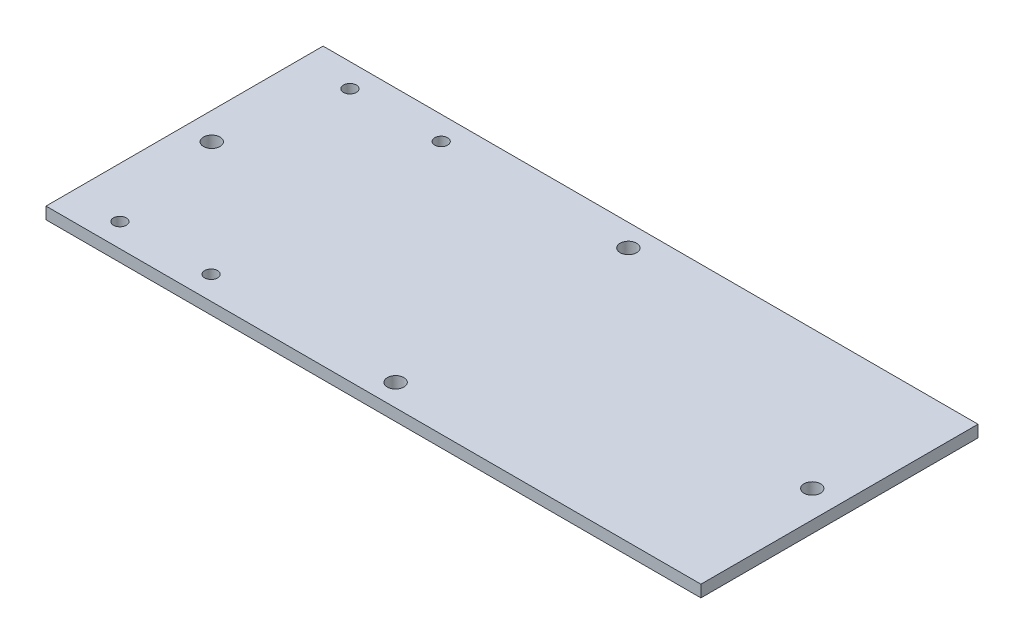
ISO-10303-21;
HEADER;
FILE_DESCRIPTION(('STEP AP214'),'2;1');
FILE_NAME('part.step','',(''),(''),'','','');
FILE_SCHEMA(('AUTOMOTIVE_DESIGN { 1 0 10303 214 1 1 1 1 }'));
ENDSEC;
DATA;
#1=APPLICATION_CONTEXT('core data for automotive mechanical design processes');
#2=APPLICATION_PROTOCOL_DEFINITION('international standard','automotive_design',2000,#1);
#3=PRODUCT_CONTEXT('',#1,'mechanical');
#4=PRODUCT('Part','Part','',(#3));
#5=PRODUCT_RELATED_PRODUCT_CATEGORY('part','',(#4));
#6=PRODUCT_DEFINITION_FORMATION('','',#4);
#7=PRODUCT_DEFINITION_CONTEXT('part definition',#1,'design');
#8=PRODUCT_DEFINITION('design','',#6,#7);
#9=PRODUCT_DEFINITION_SHAPE('','',#8);
#10=(LENGTH_UNIT() NAMED_UNIT(*) SI_UNIT(.MILLI.,.METRE.));
#11=(NAMED_UNIT(*) PLANE_ANGLE_UNIT() SI_UNIT($,.RADIAN.));
#12=(NAMED_UNIT(*) SI_UNIT($,.STERADIAN.) SOLID_ANGLE_UNIT());
#13=UNCERTAINTY_MEASURE_WITH_UNIT(LENGTH_MEASURE(1.E-05),#10,'distance_accuracy_value','');
#14=(GEOMETRIC_REPRESENTATION_CONTEXT(3) GLOBAL_UNCERTAINTY_ASSIGNED_CONTEXT((#13)) GLOBAL_UNIT_ASSIGNED_CONTEXT((#10,
#11,#12)) REPRESENTATION_CONTEXT('',''));
#15=CARTESIAN_POINT('',(0.,0.,0.));
#16=DIRECTION('',(0.,0.,1.));
#17=DIRECTION('',(1.,0.,0.));
#18=AXIS2_PLACEMENT_3D('',#15,#16,#17);
#19=CARTESIAN_POINT('',(-82.55,3.,34.925));
#20=DIRECTION('',(1.,0.,0.));
#21=DIRECTION('',(0.,0.,-1.));
#22=AXIS2_PLACEMENT_3D('',#19,#20,#21);
#23=PLANE('',#22);
#24=DIRECTION('',(0.,0.,1.));
#25=VECTOR('',#24,1.);
#26=CARTESIAN_POINT('',(-82.55,0.,34.925));
#27=LINE('',#26,#25);
#28=CARTESIAN_POINT('',(-82.55,0.,-34.925));
#29=VERTEX_POINT('',#28);
#30=CARTESIAN_POINT('',(-82.55,0.,34.925));
#31=VERTEX_POINT('',#30);
#32=EDGE_CURVE('E103',#29,#31,#27,.T.);
#33=ORIENTED_EDGE('',*,*,#32,.T.);
#34=DIRECTION('',(0.,-1.,0.));
#35=VECTOR('',#34,1.);
#36=CARTESIAN_POINT('',(-82.55,3.,34.925));
#37=LINE('',#36,#35);
#38=CARTESIAN_POINT('',(-82.55,3.,34.925));
#39=VERTEX_POINT('',#38);
#40=EDGE_CURVE('E11',#39,#31,#37,.T.);
#41=ORIENTED_EDGE('',*,*,#40,.F.);
#42=DIRECTION('',(0.,0.,1.));
#43=VECTOR('',#42,1.);
#44=CARTESIAN_POINT('',(-82.55,3.,34.925));
#45=LINE('',#44,#43);
#46=CARTESIAN_POINT('',(-82.55,3.,-34.925));
#47=VERTEX_POINT('',#46);
#48=EDGE_CURVE('E90',#47,#39,#45,.T.);
#49=ORIENTED_EDGE('',*,*,#48,.F.);
#50=DIRECTION('',(0.,-1.,0.));
#51=VECTOR('',#50,1.);
#52=CARTESIAN_POINT('',(-82.55,3.,-34.925));
#53=LINE('',#52,#51);
#54=EDGE_CURVE('E99',#47,#29,#53,.T.);
#55=ORIENTED_EDGE('',*,*,#54,.T.);
#56=EDGE_LOOP('',(#33,#41,#49,#55));
#57=FACE_BOUND('',#56,.T.);
#58=ADVANCED_FACE('F37',(#57),#23,.F.);
#59=CARTESIAN_POINT('',(-82.55,3.,34.925));
#60=DIRECTION('',(0.,0.,-1.));
#61=DIRECTION('',(-1.,0.,0.));
#62=AXIS2_PLACEMENT_3D('',#59,#60,#61);
#63=PLANE('',#62);
#64=DIRECTION('',(1.,0.,0.));
#65=VECTOR('',#64,1.);
#66=CARTESIAN_POINT('',(-82.55,0.,34.925));
#67=LINE('',#66,#65);
#68=CARTESIAN_POINT('',(82.55,0.,34.925));
#69=VERTEX_POINT('',#68);
#70=EDGE_CURVE('E94',#31,#69,#67,.T.);
#71=ORIENTED_EDGE('',*,*,#70,.T.);
#72=DIRECTION('',(0.,-1.,0.));
#73=VECTOR('',#72,1.);
#74=CARTESIAN_POINT('',(82.55,3.,34.925));
#75=LINE('',#74,#73);
#76=CARTESIAN_POINT('',(82.55,3.,34.925));
#77=VERTEX_POINT('',#76);
#78=EDGE_CURVE('E46',#77,#69,#75,.T.);
#79=ORIENTED_EDGE('',*,*,#78,.F.);
#80=DIRECTION('',(1.,0.,0.));
#81=VECTOR('',#80,1.);
#82=CARTESIAN_POINT('',(-82.55,3.,34.925));
#83=LINE('',#82,#81);
#84=EDGE_CURVE('E85',#39,#77,#83,.T.);
#85=ORIENTED_EDGE('',*,*,#84,.F.);
#86=ORIENTED_EDGE('',*,*,#40,.T.);
#87=EDGE_LOOP('',(#71,#79,#85,#86));
#88=FACE_BOUND('',#87,.T.);
#89=ADVANCED_FACE('F93',(#88),#63,.F.);
#90=CARTESIAN_POINT('',(82.55,3.,34.925));
#91=DIRECTION('',(-1.,0.,0.));
#92=DIRECTION('',(0.,0.,1.));
#93=AXIS2_PLACEMENT_3D('',#90,#91,#92);
#94=PLANE('',#93);
#95=DIRECTION('',(0.,0.,-1.));
#96=VECTOR('',#95,1.);
#97=CARTESIAN_POINT('',(82.55,0.,34.925));
#98=LINE('',#97,#96);
#99=CARTESIAN_POINT('',(82.55,0.,-34.925));
#100=VERTEX_POINT('',#99);
#101=EDGE_CURVE('E72',#69,#100,#98,.T.);
#102=ORIENTED_EDGE('',*,*,#101,.T.);
#103=DIRECTION('',(0.,-1.,0.));
#104=VECTOR('',#103,1.);
#105=CARTESIAN_POINT('',(82.55,3.,-34.925));
#106=LINE('',#105,#104);
#107=CARTESIAN_POINT('',(82.55,3.,-34.925));
#108=VERTEX_POINT('',#107);
#109=EDGE_CURVE('E95',#108,#100,#106,.T.);
#110=ORIENTED_EDGE('',*,*,#109,.F.);
#111=DIRECTION('',(0.,0.,-1.));
#112=VECTOR('',#111,1.);
#113=CARTESIAN_POINT('',(82.55,3.,34.925));
#114=LINE('',#113,#112);
#115=EDGE_CURVE('E88',#77,#108,#114,.T.);
#116=ORIENTED_EDGE('',*,*,#115,.F.);
#117=ORIENTED_EDGE('',*,*,#78,.T.);
#118=EDGE_LOOP('',(#102,#110,#116,#117));
#119=FACE_BOUND('',#118,.T.);
#120=ADVANCED_FACE('F97',(#119),#94,.F.);
#121=CARTESIAN_POINT('',(-82.55,3.,-34.925));
#122=DIRECTION('',(0.,0.,1.));
#123=DIRECTION('',(1.,0.,0.));
#124=AXIS2_PLACEMENT_3D('',#121,#122,#123);
#125=PLANE('',#124);
#126=DIRECTION('',(-1.,0.,0.));
#127=VECTOR('',#126,1.);
#128=CARTESIAN_POINT('',(-82.55,0.,-34.925));
#129=LINE('',#128,#127);
#130=EDGE_CURVE('E78',#100,#29,#129,.T.);
#131=ORIENTED_EDGE('',*,*,#130,.T.);
#132=ORIENTED_EDGE('',*,*,#54,.F.);
#133=DIRECTION('',(-1.,0.,0.));
#134=VECTOR('',#133,1.);
#135=CARTESIAN_POINT('',(-82.55,3.,-34.925));
#136=LINE('',#135,#134);
#137=EDGE_CURVE('E55',#108,#47,#136,.T.);
#138=ORIENTED_EDGE('',*,*,#137,.F.);
#139=ORIENTED_EDGE('',*,*,#109,.T.);
#140=EDGE_LOOP('',(#131,#132,#138,#139));
#141=FACE_BOUND('',#140,.T.);
#142=ADVANCED_FACE('F168',(#141),#125,.F.);
#143=CARTESIAN_POINT('',(0.,3.,0.));
#144=DIRECTION('',(0.,-1.,0.));
#145=DIRECTION('',(0.,0.,-1.));
#146=AXIS2_PLACEMENT_3D('',#143,#144,#145);
#147=PLANE('',#146);
#148=CARTESIAN_POINT('',(-69.85,3.,-29.));
#149=DIRECTION('',(0.,1.,0.));
#150=DIRECTION('',(0.,0.,1.));
#151=AXIS2_PLACEMENT_3D('',#148,#149,#150);
#152=CIRCLE('',#151,1.625);
#153=CARTESIAN_POINT('',(-69.85,3.,-27.375));
#154=VERTEX_POINT('',#153);
#155=EDGE_CURVE('E153',#154,#154,#152,.T.);
#156=ORIENTED_EDGE('',*,*,#155,.F.);
#157=EDGE_LOOP('',(#156));
#158=FACE_BOUND('',#157,.T.);
#159=CARTESIAN_POINT('',(-46.85,3.,29.));
#160=DIRECTION('',(0.,1.,0.));
#161=DIRECTION('',(0.,0.,1.));
#162=AXIS2_PLACEMENT_3D('',#159,#160,#161);
#163=CIRCLE('',#162,1.625);
#164=CARTESIAN_POINT('',(-46.85,3.,30.625));
#165=VERTEX_POINT('',#164);
#166=EDGE_CURVE('E154',#165,#165,#163,.T.);
#167=ORIENTED_EDGE('',*,*,#166,.F.);
#168=EDGE_LOOP('',(#167));
#169=FACE_BOUND('',#168,.T.);
#170=CARTESIAN_POINT('',(-69.85,3.,29.));
#171=DIRECTION('',(0.,1.,0.));
#172=DIRECTION('',(0.,0.,1.));
#173=AXIS2_PLACEMENT_3D('',#170,#171,#172);
#174=CIRCLE('',#173,1.625);
#175=CARTESIAN_POINT('',(-69.85,3.,30.625));
#176=VERTEX_POINT('',#175);
#177=EDGE_CURVE('E157',#176,#176,#174,.T.);
#178=ORIENTED_EDGE('',*,*,#177,.F.);
#179=EDGE_LOOP('',(#178));
#180=FACE_BOUND('',#179,.T.);
#181=CARTESIAN_POINT('',(-46.85,3.,-29.));
#182=DIRECTION('',(0.,1.,0.));
#183=DIRECTION('',(0.,0.,1.));
#184=AXIS2_PLACEMENT_3D('',#181,#182,#183);
#185=CIRCLE('',#184,1.625);
#186=CARTESIAN_POINT('',(-46.85,3.,-27.375));
#187=VERTEX_POINT('',#186);
#188=EDGE_CURVE('E128',#187,#187,#185,.T.);
#189=ORIENTED_EDGE('',*,*,#188,.F.);
#190=EDGE_LOOP('',(#189));
#191=FACE_BOUND('',#190,.T.);
#192=CARTESIAN_POINT('',(-75.692,3.,0.));
#193=DIRECTION('',(0.,1.,0.));
#194=DIRECTION('',(0.,0.,1.));
#195=AXIS2_PLACEMENT_3D('',#192,#193,#194);
#196=CIRCLE('',#195,2.0828);
#197=CARTESIAN_POINT('',(-75.692,3.,2.0828));
#198=VERTEX_POINT('',#197);
#199=EDGE_CURVE('E116',#198,#198,#196,.T.);
#200=ORIENTED_EDGE('',*,*,#199,.F.);
#201=EDGE_LOOP('',(#200));
#202=FACE_BOUND('',#201,.T.);
#203=CARTESIAN_POINT('',(75.692,3.,0.));
#204=DIRECTION('',(0.,1.,0.));
#205=DIRECTION('',(0.,0.,1.));
#206=AXIS2_PLACEMENT_3D('',#203,#204,#205);
#207=CIRCLE('',#206,2.0828);
#208=CARTESIAN_POINT('',(75.692,3.,2.0828));
#209=VERTEX_POINT('',#208);
#210=EDGE_CURVE('E144',#209,#209,#207,.T.);
#211=ORIENTED_EDGE('',*,*,#210,.F.);
#212=EDGE_LOOP('',(#211));
#213=FACE_BOUND('',#212,.T.);
#214=CARTESIAN_POINT('',(0.,3.,29.337));
#215=DIRECTION('',(0.,1.,0.));
#216=DIRECTION('',(0.,0.,1.));
#217=AXIS2_PLACEMENT_3D('',#214,#215,#216);
#218=CIRCLE('',#217,2.0828);
#219=CARTESIAN_POINT('',(0.,3.,31.4198));
#220=VERTEX_POINT('',#219);
#221=EDGE_CURVE('E139',#220,#220,#218,.T.);
#222=ORIENTED_EDGE('',*,*,#221,.F.);
#223=EDGE_LOOP('',(#222));
#224=FACE_BOUND('',#223,.T.);
#225=CARTESIAN_POINT('',(0.,3.,-29.337));
#226=DIRECTION('',(0.,1.,0.));
#227=DIRECTION('',(0.,0.,1.));
#228=AXIS2_PLACEMENT_3D('',#225,#226,#227);
#229=CIRCLE('',#228,2.0828);
#230=CARTESIAN_POINT('',(0.,3.,-27.2542));
#231=VERTEX_POINT('',#230);
#232=EDGE_CURVE('E135',#231,#231,#229,.T.);
#233=ORIENTED_EDGE('',*,*,#232,.F.);
#234=EDGE_LOOP('',(#233));
#235=FACE_BOUND('',#234,.T.);
#236=ORIENTED_EDGE('',*,*,#48,.T.);
#237=ORIENTED_EDGE('',*,*,#84,.T.);
#238=ORIENTED_EDGE('',*,*,#115,.T.);
#239=ORIENTED_EDGE('',*,*,#137,.T.);
#240=EDGE_LOOP('',(#236,#237,#238,#239));
#241=FACE_BOUND('',#240,.T.);
#242=ADVANCED_FACE('F86',(#158,#169,#180,#191,#202,#213,#224,#235,#241),#147,.F.);
#243=CARTESIAN_POINT('',(0.,0.,0.));
#244=DIRECTION('',(0.,-1.,0.));
#245=DIRECTION('',(0.,0.,-1.));
#246=AXIS2_PLACEMENT_3D('',#243,#244,#245);
#247=PLANE('',#246);
#248=CARTESIAN_POINT('',(-69.85,0.,-29.));
#249=DIRECTION('',(0.,-1.,0.));
#250=DIRECTION('',(0.,0.,-1.));
#251=AXIS2_PLACEMENT_3D('',#248,#249,#250);
#252=CIRCLE('',#251,1.625);
#253=CARTESIAN_POINT('',(-69.85,0.,-30.625));
#254=VERTEX_POINT('',#253);
#255=EDGE_CURVE('E40',#254,#254,#252,.T.);
#256=ORIENTED_EDGE('',*,*,#255,.F.);
#257=EDGE_LOOP('',(#256));
#258=FACE_BOUND('',#257,.T.);
#259=CARTESIAN_POINT('',(-46.85,0.,29.));
#260=DIRECTION('',(0.,-1.,0.));
#261=DIRECTION('',(0.,0.,-1.));
#262=AXIS2_PLACEMENT_3D('',#259,#260,#261);
#263=CIRCLE('',#262,1.625);
#264=CARTESIAN_POINT('',(-46.85,0.,27.375));
#265=VERTEX_POINT('',#264);
#266=EDGE_CURVE('E130',#265,#265,#263,.T.);
#267=ORIENTED_EDGE('',*,*,#266,.F.);
#268=EDGE_LOOP('',(#267));
#269=FACE_BOUND('',#268,.T.);
#270=CARTESIAN_POINT('',(-69.85,0.,29.));
#271=DIRECTION('',(0.,-1.,0.));
#272=DIRECTION('',(0.,0.,-1.));
#273=AXIS2_PLACEMENT_3D('',#270,#271,#272);
#274=CIRCLE('',#273,1.625);
#275=CARTESIAN_POINT('',(-69.85,0.,27.375));
#276=VERTEX_POINT('',#275);
#277=EDGE_CURVE('E127',#276,#276,#274,.T.);
#278=ORIENTED_EDGE('',*,*,#277,.F.);
#279=EDGE_LOOP('',(#278));
#280=FACE_BOUND('',#279,.T.);
#281=CARTESIAN_POINT('',(-46.85,0.,-29.));
#282=DIRECTION('',(0.,-1.,0.));
#283=DIRECTION('',(0.,0.,-1.));
#284=AXIS2_PLACEMENT_3D('',#281,#282,#283);
#285=CIRCLE('',#284,1.625);
#286=CARTESIAN_POINT('',(-46.85,0.,-30.625));
#287=VERTEX_POINT('',#286);
#288=EDGE_CURVE('E124',#287,#287,#285,.T.);
#289=ORIENTED_EDGE('',*,*,#288,.F.);
#290=EDGE_LOOP('',(#289));
#291=FACE_BOUND('',#290,.T.);
#292=CARTESIAN_POINT('',(-75.692,0.,0.));
#293=DIRECTION('',(0.,-1.,0.));
#294=DIRECTION('',(0.,0.,-1.));
#295=AXIS2_PLACEMENT_3D('',#292,#293,#294);
#296=CIRCLE('',#295,2.0828);
#297=CARTESIAN_POINT('',(-75.692,0.,-2.0828));
#298=VERTEX_POINT('',#297);
#299=EDGE_CURVE('E106',#298,#298,#296,.T.);
#300=ORIENTED_EDGE('',*,*,#299,.F.);
#301=EDGE_LOOP('',(#300));
#302=FACE_BOUND('',#301,.T.);
#303=CARTESIAN_POINT('',(75.692,0.,0.));
#304=DIRECTION('',(0.,-1.,0.));
#305=DIRECTION('',(0.,0.,-1.));
#306=AXIS2_PLACEMENT_3D('',#303,#304,#305);
#307=CIRCLE('',#306,2.0828);
#308=CARTESIAN_POINT('',(75.692,0.,-2.0828));
#309=VERTEX_POINT('',#308);
#310=EDGE_CURVE('E119',#309,#309,#307,.T.);
#311=ORIENTED_EDGE('',*,*,#310,.F.);
#312=EDGE_LOOP('',(#311));
#313=FACE_BOUND('',#312,.T.);
#314=CARTESIAN_POINT('',(0.,0.,29.337));
#315=DIRECTION('',(0.,-1.,0.));
#316=DIRECTION('',(0.,0.,-1.));
#317=AXIS2_PLACEMENT_3D('',#314,#315,#316);
#318=CIRCLE('',#317,2.0828);
#319=CARTESIAN_POINT('',(0.,0.,27.2542));
#320=VERTEX_POINT('',#319);
#321=EDGE_CURVE('E115',#320,#320,#318,.T.);
#322=ORIENTED_EDGE('',*,*,#321,.F.);
#323=EDGE_LOOP('',(#322));
#324=FACE_BOUND('',#323,.T.);
#325=CARTESIAN_POINT('',(0.,0.,-29.337));
#326=DIRECTION('',(0.,-1.,0.));
#327=DIRECTION('',(0.,0.,-1.));
#328=AXIS2_PLACEMENT_3D('',#325,#326,#327);
#329=CIRCLE('',#328,2.0828);
#330=CARTESIAN_POINT('',(0.,0.,-31.4198));
#331=VERTEX_POINT('',#330);
#332=EDGE_CURVE('E112',#331,#331,#329,.T.);
#333=ORIENTED_EDGE('',*,*,#332,.F.);
#334=EDGE_LOOP('',(#333));
#335=FACE_BOUND('',#334,.T.);
#336=ORIENTED_EDGE('',*,*,#32,.F.);
#337=ORIENTED_EDGE('',*,*,#130,.F.);
#338=ORIENTED_EDGE('',*,*,#101,.F.);
#339=ORIENTED_EDGE('',*,*,#70,.F.);
#340=EDGE_LOOP('',(#336,#337,#338,#339));
#341=FACE_BOUND('',#340,.T.);
#342=ADVANCED_FACE('F167',(#258,#269,#280,#291,#302,#313,#324,#335,#341),#247,.T.);
#343=CARTESIAN_POINT('',(0.,-2.08,-29.337));
#344=DIRECTION('',(0.,1.,0.));
#345=DIRECTION('',(0.,0.,1.));
#346=AXIS2_PLACEMENT_3D('',#343,#344,#345);
#347=CYLINDRICAL_SURFACE('',#346,2.0828);
#348=ORIENTED_EDGE('',*,*,#332,.T.);
#349=EDGE_LOOP('',(#348));
#350=FACE_BOUND('',#349,.T.);
#351=ORIENTED_EDGE('',*,*,#232,.T.);
#352=EDGE_LOOP('',(#351));
#353=FACE_BOUND('',#352,.T.);
#354=ADVANCED_FACE('F183',(#350,#353),#347,.F.);
#355=CARTESIAN_POINT('',(0.,-2.08,29.337));
#356=DIRECTION('',(0.,1.,0.));
#357=DIRECTION('',(0.,0.,1.));
#358=AXIS2_PLACEMENT_3D('',#355,#356,#357);
#359=CYLINDRICAL_SURFACE('',#358,2.0828);
#360=ORIENTED_EDGE('',*,*,#321,.T.);
#361=EDGE_LOOP('',(#360));
#362=FACE_BOUND('',#361,.T.);
#363=ORIENTED_EDGE('',*,*,#221,.T.);
#364=EDGE_LOOP('',(#363));
#365=FACE_BOUND('',#364,.T.);
#366=ADVANCED_FACE('F180',(#362,#365),#359,.F.);
#367=CARTESIAN_POINT('',(75.692,-2.08,0.));
#368=DIRECTION('',(0.,1.,0.));
#369=DIRECTION('',(0.,0.,1.));
#370=AXIS2_PLACEMENT_3D('',#367,#368,#369);
#371=CYLINDRICAL_SURFACE('',#370,2.0828);
#372=ORIENTED_EDGE('',*,*,#310,.T.);
#373=EDGE_LOOP('',(#372));
#374=FACE_BOUND('',#373,.T.);
#375=ORIENTED_EDGE('',*,*,#210,.T.);
#376=EDGE_LOOP('',(#375));
#377=FACE_BOUND('',#376,.T.);
#378=ADVANCED_FACE('F182',(#374,#377),#371,.F.);
#379=CARTESIAN_POINT('',(-75.692,-2.08,0.));
#380=DIRECTION('',(0.,1.,0.));
#381=DIRECTION('',(0.,0.,1.));
#382=AXIS2_PLACEMENT_3D('',#379,#380,#381);
#383=CYLINDRICAL_SURFACE('',#382,2.0828);
#384=ORIENTED_EDGE('',*,*,#299,.T.);
#385=EDGE_LOOP('',(#384));
#386=FACE_BOUND('',#385,.T.);
#387=ORIENTED_EDGE('',*,*,#199,.T.);
#388=EDGE_LOOP('',(#387));
#389=FACE_BOUND('',#388,.T.);
#390=ADVANCED_FACE('F190',(#386,#389),#383,.F.);
#391=CARTESIAN_POINT('',(-46.85,-14.78,-29.));
#392=DIRECTION('',(0.,1.,0.));
#393=DIRECTION('',(0.,0.,1.));
#394=AXIS2_PLACEMENT_3D('',#391,#392,#393);
#395=CYLINDRICAL_SURFACE('',#394,1.625);
#396=ORIENTED_EDGE('',*,*,#288,.T.);
#397=EDGE_LOOP('',(#396));
#398=FACE_BOUND('',#397,.T.);
#399=ORIENTED_EDGE('',*,*,#188,.T.);
#400=EDGE_LOOP('',(#399));
#401=FACE_BOUND('',#400,.T.);
#402=ADVANCED_FACE('F240',(#398,#401),#395,.F.);
#403=CARTESIAN_POINT('',(-69.85,-14.78,29.));
#404=DIRECTION('',(0.,1.,0.));
#405=DIRECTION('',(0.,0.,1.));
#406=AXIS2_PLACEMENT_3D('',#403,#404,#405);
#407=CYLINDRICAL_SURFACE('',#406,1.625);
#408=ORIENTED_EDGE('',*,*,#277,.T.);
#409=EDGE_LOOP('',(#408));
#410=FACE_BOUND('',#409,.T.);
#411=ORIENTED_EDGE('',*,*,#177,.T.);
#412=EDGE_LOOP('',(#411));
#413=FACE_BOUND('',#412,.T.);
#414=ADVANCED_FACE('F163',(#410,#413),#407,.F.);
#415=CARTESIAN_POINT('',(-46.85,-14.78,29.));
#416=DIRECTION('',(0.,1.,0.));
#417=DIRECTION('',(0.,0.,1.));
#418=AXIS2_PLACEMENT_3D('',#415,#416,#417);
#419=CYLINDRICAL_SURFACE('',#418,1.625);
#420=ORIENTED_EDGE('',*,*,#266,.T.);
#421=EDGE_LOOP('',(#420));
#422=FACE_BOUND('',#421,.T.);
#423=ORIENTED_EDGE('',*,*,#166,.T.);
#424=EDGE_LOOP('',(#423));
#425=FACE_BOUND('',#424,.T.);
#426=ADVANCED_FACE('F254',(#422,#425),#419,.F.);
#427=CARTESIAN_POINT('',(-69.85,-14.78,-29.));
#428=DIRECTION('',(0.,1.,0.));
#429=DIRECTION('',(0.,0.,1.));
#430=AXIS2_PLACEMENT_3D('',#427,#428,#429);
#431=CYLINDRICAL_SURFACE('',#430,1.625);
#432=ORIENTED_EDGE('',*,*,#255,.T.);
#433=EDGE_LOOP('',(#432));
#434=FACE_BOUND('',#433,.T.);
#435=ORIENTED_EDGE('',*,*,#155,.T.);
#436=EDGE_LOOP('',(#435));
#437=FACE_BOUND('',#436,.T.);
#438=ADVANCED_FACE('F264',(#434,#437),#431,.F.);
#439=CLOSED_SHELL('',(#58,#89,#120,#142,#242,#342,#354,#366,#378,#390,#402,#414,#426,#438));
#440=MANIFOLD_SOLID_BREP('B2',#439);
#441=ADVANCED_BREP_SHAPE_REPRESENTATION('',(#18,#440),#14);
#442=SHAPE_DEFINITION_REPRESENTATION(#9,#441);
ENDSEC;
END-ISO-10303-21;
